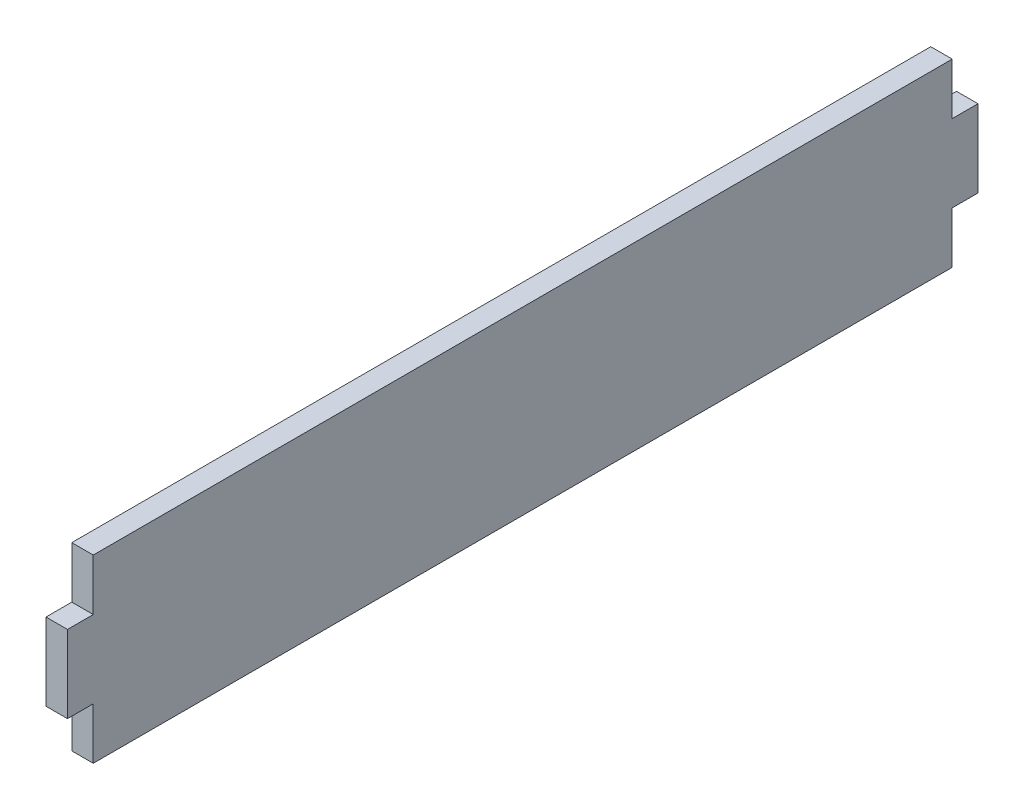
ISO-10303-21;
HEADER;
FILE_DESCRIPTION(('STEP AP214'),'2;1');
FILE_NAME('part.step','',(''),(''),'','','');
FILE_SCHEMA(('AUTOMOTIVE_DESIGN { 1 0 10303 214 1 1 1 1 }'));
ENDSEC;
DATA;
#1=APPLICATION_CONTEXT('core data for automotive mechanical design processes');
#2=APPLICATION_PROTOCOL_DEFINITION('international standard','automotive_design',2000,#1);
#3=PRODUCT_CONTEXT('',#1,'mechanical');
#4=PRODUCT('Part','Part','',(#3));
#5=PRODUCT_RELATED_PRODUCT_CATEGORY('part','',(#4));
#6=PRODUCT_DEFINITION_FORMATION('','',#4);
#7=PRODUCT_DEFINITION_CONTEXT('part definition',#1,'design');
#8=PRODUCT_DEFINITION('design','',#6,#7);
#9=PRODUCT_DEFINITION_SHAPE('','',#8);
#10=(LENGTH_UNIT() NAMED_UNIT(*) SI_UNIT(.MILLI.,.METRE.));
#11=(NAMED_UNIT(*) PLANE_ANGLE_UNIT() SI_UNIT($,.RADIAN.));
#12=(NAMED_UNIT(*) SI_UNIT($,.STERADIAN.) SOLID_ANGLE_UNIT());
#13=UNCERTAINTY_MEASURE_WITH_UNIT(LENGTH_MEASURE(1.E-05),#10,'distance_accuracy_value','');
#14=(GEOMETRIC_REPRESENTATION_CONTEXT(3) GLOBAL_UNCERTAINTY_ASSIGNED_CONTEXT((#13)) GLOBAL_UNIT_ASSIGNED_CONTEXT((#10,
#11,#12)) REPRESENTATION_CONTEXT('',''));
#15=CARTESIAN_POINT('',(0.,0.,0.));
#16=DIRECTION('',(0.,0.,1.));
#17=DIRECTION('',(1.,0.,0.));
#18=AXIS2_PLACEMENT_3D('',#15,#16,#17);
#19=CARTESIAN_POINT('',(0.,0.,100.));
#20=DIRECTION('',(0.,0.,1.));
#21=DIRECTION('',(1.,0.,0.));
#22=AXIS2_PLACEMENT_3D('',#19,#20,#21);
#23=PLANE('',#22);
#24=DIRECTION('',(0.,-1.,0.));
#25=VECTOR('',#24,1.);
#26=CARTESIAN_POINT('',(1.25,0.,100.));
#27=LINE('',#26,#25);
#28=CARTESIAN_POINT('',(1.25,-4.5,100.));
#29=VERTEX_POINT('',#28);
#30=CARTESIAN_POINT('',(1.25,-10.5,100.));
#31=VERTEX_POINT('',#30);
#32=EDGE_CURVE('E199',#29,#31,#27,.T.);
#33=ORIENTED_EDGE('',*,*,#32,.F.);
#34=DIRECTION('',(-1.,0.,0.));
#35=VECTOR('',#34,1.);
#36=CARTESIAN_POINT('',(0.,-4.5,100.));
#37=LINE('',#36,#35);
#38=CARTESIAN_POINT('',(-1.25,-4.5,100.));
#39=VERTEX_POINT('',#38);
#40=EDGE_CURVE('E158',#29,#39,#37,.T.);
#41=ORIENTED_EDGE('',*,*,#40,.T.);
#42=DIRECTION('',(0.,-1.,0.));
#43=VECTOR('',#42,1.);
#44=CARTESIAN_POINT('',(-1.25,0.,100.));
#45=LINE('',#44,#43);
#46=CARTESIAN_POINT('',(-1.25,-10.5,100.));
#47=VERTEX_POINT('',#46);
#48=EDGE_CURVE('E147',#39,#47,#45,.T.);
#49=ORIENTED_EDGE('',*,*,#48,.T.);
#50=DIRECTION('',(1.,0.,0.));
#51=VECTOR('',#50,1.);
#52=CARTESIAN_POINT('',(0.,-10.5,100.));
#53=LINE('',#52,#51);
#54=EDGE_CURVE('E196',#47,#31,#53,.T.);
#55=ORIENTED_EDGE('',*,*,#54,.T.);
#56=EDGE_LOOP('',(#33,#41,#49,#55));
#57=FACE_BOUND('',#56,.T.);
#58=ADVANCED_FACE('F42',(#57),#23,.T.);
#59=CARTESIAN_POINT('',(-1.25,10.5,100.));
#60=VERTEX_POINT('',#59);
#61=CARTESIAN_POINT('',(-1.25,4.5,100.));
#62=VERTEX_POINT('',#61);
#63=EDGE_CURVE('E193',#60,#62,#45,.T.);
#64=ORIENTED_EDGE('',*,*,#63,.T.);
#65=DIRECTION('',(1.,0.,0.));
#66=VECTOR('',#65,1.);
#67=CARTESIAN_POINT('',(0.,4.5,100.));
#68=LINE('',#67,#66);
#69=CARTESIAN_POINT('',(1.25,4.5,100.));
#70=VERTEX_POINT('',#69);
#71=EDGE_CURVE('E156',#62,#70,#68,.T.);
#72=ORIENTED_EDGE('',*,*,#71,.T.);
#73=CARTESIAN_POINT('',(1.25,10.5,100.));
#74=VERTEX_POINT('',#73);
#75=EDGE_CURVE('E200',#74,#70,#27,.T.);
#76=ORIENTED_EDGE('',*,*,#75,.F.);
#77=DIRECTION('',(1.,0.,0.));
#78=VECTOR('',#77,1.);
#79=CARTESIAN_POINT('',(0.,10.5,100.));
#80=LINE('',#79,#78);
#81=EDGE_CURVE('E203',#60,#74,#80,.T.);
#82=ORIENTED_EDGE('',*,*,#81,.F.);
#83=EDGE_LOOP('',(#64,#72,#76,#82));
#84=FACE_BOUND('',#83,.T.);
#85=ADVANCED_FACE('F254',(#84),#23,.T.);
#86=CARTESIAN_POINT('',(0.,0.,0.));
#87=DIRECTION('',(0.,0.,1.));
#88=DIRECTION('',(1.,0.,0.));
#89=AXIS2_PLACEMENT_3D('',#86,#87,#88);
#90=PLANE('',#89);
#91=DIRECTION('',(-1.,0.,0.));
#92=VECTOR('',#91,1.);
#93=CARTESIAN_POINT('',(0.,-4.5,0.));
#94=LINE('',#93,#92);
#95=CARTESIAN_POINT('',(1.25,-4.5,0.));
#96=VERTEX_POINT('',#95);
#97=CARTESIAN_POINT('',(-1.25,-4.5,0.));
#98=VERTEX_POINT('',#97);
#99=EDGE_CURVE('E65',#96,#98,#94,.T.);
#100=ORIENTED_EDGE('',*,*,#99,.F.);
#101=DIRECTION('',(0.,-1.,0.));
#102=VECTOR('',#101,1.);
#103=CARTESIAN_POINT('',(1.25,0.,0.));
#104=LINE('',#103,#102);
#105=CARTESIAN_POINT('',(1.25,-10.5,0.));
#106=VERTEX_POINT('',#105);
#107=EDGE_CURVE('E212',#96,#106,#104,.T.);
#108=ORIENTED_EDGE('',*,*,#107,.T.);
#109=DIRECTION('',(1.,0.,0.));
#110=VECTOR('',#109,1.);
#111=CARTESIAN_POINT('',(0.,-10.5,0.));
#112=LINE('',#111,#110);
#113=CARTESIAN_POINT('',(-1.25,-10.5,0.));
#114=VERTEX_POINT('',#113);
#115=EDGE_CURVE('E209',#114,#106,#112,.T.);
#116=ORIENTED_EDGE('',*,*,#115,.F.);
#117=DIRECTION('',(0.,-1.,0.));
#118=VECTOR('',#117,1.);
#119=CARTESIAN_POINT('',(-1.25,0.,0.));
#120=LINE('',#119,#118);
#121=EDGE_CURVE('E184',#98,#114,#120,.T.);
#122=ORIENTED_EDGE('',*,*,#121,.F.);
#123=EDGE_LOOP('',(#100,#108,#116,#122));
#124=FACE_BOUND('',#123,.T.);
#125=ADVANCED_FACE('F231',(#124),#90,.F.);
#126=DIRECTION('',(1.,0.,0.));
#127=VECTOR('',#126,1.);
#128=CARTESIAN_POINT('',(0.,4.5,0.));
#129=LINE('',#128,#127);
#130=CARTESIAN_POINT('',(-1.25,4.5,0.));
#131=VERTEX_POINT('',#130);
#132=CARTESIAN_POINT('',(1.25,4.5,0.));
#133=VERTEX_POINT('',#132);
#134=EDGE_CURVE('E170',#131,#133,#129,.T.);
#135=ORIENTED_EDGE('',*,*,#134,.F.);
#136=CARTESIAN_POINT('',(-1.25,10.5,0.));
#137=VERTEX_POINT('',#136);
#138=EDGE_CURVE('E207',#137,#131,#120,.T.);
#139=ORIENTED_EDGE('',*,*,#138,.F.);
#140=DIRECTION('',(1.,0.,0.));
#141=VECTOR('',#140,1.);
#142=CARTESIAN_POINT('',(0.,10.5,0.));
#143=LINE('',#142,#141);
#144=CARTESIAN_POINT('',(1.25,10.5,0.));
#145=VERTEX_POINT('',#144);
#146=EDGE_CURVE('E215',#137,#145,#143,.T.);
#147=ORIENTED_EDGE('',*,*,#146,.T.);
#148=EDGE_CURVE('E213',#145,#133,#104,.T.);
#149=ORIENTED_EDGE('',*,*,#148,.T.);
#150=EDGE_LOOP('',(#135,#139,#147,#149));
#151=FACE_BOUND('',#150,.T.);
#152=ADVANCED_FACE('F246',(#151),#90,.F.);
#153=CARTESIAN_POINT('',(-1.25,0.,100.));
#154=DIRECTION('',(1.,0.,0.));
#155=DIRECTION('',(0.,1.,0.));
#156=AXIS2_PLACEMENT_3D('',#153,#154,#155);
#157=PLANE('',#156);
#158=ORIENTED_EDGE('',*,*,#138,.T.);
#159=DIRECTION('',(0.,0.,1.));
#160=VECTOR('',#159,1.);
#161=CARTESIAN_POINT('',(-1.25,4.5,-3.));
#162=LINE('',#161,#160);
#163=CARTESIAN_POINT('',(-1.25,4.5,-3.));
#164=VERTEX_POINT('',#163);
#165=EDGE_CURVE('E185',#164,#131,#162,.T.);
#166=ORIENTED_EDGE('',*,*,#165,.F.);
#167=DIRECTION('',(0.,-1.,0.));
#168=VECTOR('',#167,1.);
#169=CARTESIAN_POINT('',(-1.25,0.,-3.));
#170=LINE('',#169,#168);
#171=CARTESIAN_POINT('',(-1.25,-4.5,-3.));
#172=VERTEX_POINT('',#171);
#173=EDGE_CURVE('E174',#164,#172,#170,.T.);
#174=ORIENTED_EDGE('',*,*,#173,.T.);
#175=DIRECTION('',(0.,0.,1.));
#176=VECTOR('',#175,1.);
#177=CARTESIAN_POINT('',(-1.25,-4.5,-3.));
#178=LINE('',#177,#176);
#179=EDGE_CURVE('E181',#172,#98,#178,.T.);
#180=ORIENTED_EDGE('',*,*,#179,.T.);
#181=ORIENTED_EDGE('',*,*,#121,.T.);
#182=DIRECTION('',(0.,0.,-1.));
#183=VECTOR('',#182,1.);
#184=CARTESIAN_POINT('',(-1.25,-10.5,100.));
#185=LINE('',#184,#183);
#186=EDGE_CURVE('E11',#47,#114,#185,.T.);
#187=ORIENTED_EDGE('',*,*,#186,.F.);
#188=ORIENTED_EDGE('',*,*,#48,.F.);
#189=DIRECTION('',(0.,0.,-1.));
#190=VECTOR('',#189,1.);
#191=CARTESIAN_POINT('',(-1.25,-4.5,103.));
#192=LINE('',#191,#190);
#193=CARTESIAN_POINT('',(-1.25,-4.5,103.));
#194=VERTEX_POINT('',#193);
#195=EDGE_CURVE('E144',#194,#39,#192,.T.);
#196=ORIENTED_EDGE('',*,*,#195,.F.);
#197=DIRECTION('',(0.,-1.,0.));
#198=VECTOR('',#197,1.);
#199=CARTESIAN_POINT('',(-1.25,0.,103.));
#200=LINE('',#199,#198);
#201=CARTESIAN_POINT('',(-1.25,4.5,103.));
#202=VERTEX_POINT('',#201);
#203=EDGE_CURVE('E133',#202,#194,#200,.T.);
#204=ORIENTED_EDGE('',*,*,#203,.F.);
#205=DIRECTION('',(0.,0.,-1.));
#206=VECTOR('',#205,1.);
#207=CARTESIAN_POINT('',(-1.25,4.5,103.));
#208=LINE('',#207,#206);
#209=EDGE_CURVE('E151',#202,#62,#208,.T.);
#210=ORIENTED_EDGE('',*,*,#209,.T.);
#211=ORIENTED_EDGE('',*,*,#63,.F.);
#212=DIRECTION('',(0.,0.,-1.));
#213=VECTOR('',#212,1.);
#214=CARTESIAN_POINT('',(-1.25,10.5,100.));
#215=LINE('',#214,#213);
#216=EDGE_CURVE('E206',#60,#137,#215,.T.);
#217=ORIENTED_EDGE('',*,*,#216,.T.);
#218=EDGE_LOOP('',(#158,#166,#174,#180,#181,#187,#188,#196,#204,#210,#211,#217));
#219=FACE_BOUND('',#218,.T.);
#220=ADVANCED_FACE('F44',(#219),#157,.F.);
#221=CARTESIAN_POINT('',(0.,-10.5,100.));
#222=DIRECTION('',(0.,1.,0.));
#223=DIRECTION('',(0.,0.,1.));
#224=AXIS2_PLACEMENT_3D('',#221,#222,#223);
#225=PLANE('',#224);
#226=ORIENTED_EDGE('',*,*,#115,.T.);
#227=DIRECTION('',(0.,0.,-1.));
#228=VECTOR('',#227,1.);
#229=CARTESIAN_POINT('',(1.25,-10.5,100.));
#230=LINE('',#229,#228);
#231=EDGE_CURVE('E50',#31,#106,#230,.T.);
#232=ORIENTED_EDGE('',*,*,#231,.F.);
#233=ORIENTED_EDGE('',*,*,#54,.F.);
#234=ORIENTED_EDGE('',*,*,#186,.T.);
#235=EDGE_LOOP('',(#226,#232,#233,#234));
#236=FACE_BOUND('',#235,.T.);
#237=ADVANCED_FACE('F230',(#236),#225,.F.);
#238=CARTESIAN_POINT('',(1.25,0.,100.));
#239=DIRECTION('',(1.,0.,0.));
#240=DIRECTION('',(0.,1.,0.));
#241=AXIS2_PLACEMENT_3D('',#238,#239,#240);
#242=PLANE('',#241);
#243=ORIENTED_EDGE('',*,*,#148,.F.);
#244=DIRECTION('',(0.,0.,-1.));
#245=VECTOR('',#244,1.);
#246=CARTESIAN_POINT('',(1.25,10.5,100.));
#247=LINE('',#246,#245);
#248=EDGE_CURVE('E219',#74,#145,#247,.T.);
#249=ORIENTED_EDGE('',*,*,#248,.F.);
#250=ORIENTED_EDGE('',*,*,#75,.T.);
#251=DIRECTION('',(0.,0.,-1.));
#252=VECTOR('',#251,1.);
#253=CARTESIAN_POINT('',(1.25,4.5,103.));
#254=LINE('',#253,#252);
#255=CARTESIAN_POINT('',(1.25,4.5,103.));
#256=VERTEX_POINT('',#255);
#257=EDGE_CURVE('E57',#256,#70,#254,.T.);
#258=ORIENTED_EDGE('',*,*,#257,.F.);
#259=DIRECTION('',(0.,-1.,0.));
#260=VECTOR('',#259,1.);
#261=CARTESIAN_POINT('',(1.25,0.,103.));
#262=LINE('',#261,#260);
#263=CARTESIAN_POINT('',(1.25,-4.5,103.));
#264=VERTEX_POINT('',#263);
#265=EDGE_CURVE('E152',#256,#264,#262,.T.);
#266=ORIENTED_EDGE('',*,*,#265,.T.);
#267=DIRECTION('',(0.,0.,-1.));
#268=VECTOR('',#267,1.);
#269=CARTESIAN_POINT('',(1.25,-4.5,103.));
#270=LINE('',#269,#268);
#271=EDGE_CURVE('E155',#264,#29,#270,.T.);
#272=ORIENTED_EDGE('',*,*,#271,.T.);
#273=ORIENTED_EDGE('',*,*,#32,.T.);
#274=ORIENTED_EDGE('',*,*,#231,.T.);
#275=ORIENTED_EDGE('',*,*,#107,.F.);
#276=DIRECTION('',(0.,0.,1.));
#277=VECTOR('',#276,1.);
#278=CARTESIAN_POINT('',(1.25,-4.5,-3.));
#279=LINE('',#278,#277);
#280=CARTESIAN_POINT('',(1.25,-4.5,-3.));
#281=VERTEX_POINT('',#280);
#282=EDGE_CURVE('E177',#281,#96,#279,.T.);
#283=ORIENTED_EDGE('',*,*,#282,.F.);
#284=DIRECTION('',(0.,-1.,0.));
#285=VECTOR('',#284,1.);
#286=CARTESIAN_POINT('',(1.25,0.,-3.));
#287=LINE('',#286,#285);
#288=CARTESIAN_POINT('',(1.25,4.5,-3.));
#289=VERTEX_POINT('',#288);
#290=EDGE_CURVE('E169',#289,#281,#287,.T.);
#291=ORIENTED_EDGE('',*,*,#290,.F.);
#292=DIRECTION('',(0.,0.,1.));
#293=VECTOR('',#292,1.);
#294=CARTESIAN_POINT('',(1.25,4.5,-3.));
#295=LINE('',#294,#293);
#296=EDGE_CURVE('E188',#289,#133,#295,.T.);
#297=ORIENTED_EDGE('',*,*,#296,.T.);
#298=EDGE_LOOP('',(#243,#249,#250,#258,#266,#272,#273,#274,#275,#283,#291,#297));
#299=FACE_BOUND('',#298,.T.);
#300=ADVANCED_FACE('F224',(#299),#242,.T.);
#301=CARTESIAN_POINT('',(0.,10.5,100.));
#302=DIRECTION('',(0.,1.,0.));
#303=DIRECTION('',(0.,0.,1.));
#304=AXIS2_PLACEMENT_3D('',#301,#302,#303);
#305=PLANE('',#304);
#306=ORIENTED_EDGE('',*,*,#146,.F.);
#307=ORIENTED_EDGE('',*,*,#216,.F.);
#308=ORIENTED_EDGE('',*,*,#81,.T.);
#309=ORIENTED_EDGE('',*,*,#248,.T.);
#310=EDGE_LOOP('',(#306,#307,#308,#309));
#311=FACE_BOUND('',#310,.T.);
#312=ADVANCED_FACE('F251',(#311),#305,.T.);
#313=CARTESIAN_POINT('',(0.,-4.5,-3.));
#314=DIRECTION('',(0.,1.,0.));
#315=DIRECTION('',(0.,0.,1.));
#316=AXIS2_PLACEMENT_3D('',#313,#314,#315);
#317=PLANE('',#316);
#318=ORIENTED_EDGE('',*,*,#99,.T.);
#319=ORIENTED_EDGE('',*,*,#179,.F.);
#320=DIRECTION('',(-1.,0.,0.));
#321=VECTOR('',#320,1.);
#322=CARTESIAN_POINT('',(0.,-4.5,-3.));
#323=LINE('',#322,#321);
#324=EDGE_CURVE('E167',#281,#172,#323,.T.);
#325=ORIENTED_EDGE('',*,*,#324,.F.);
#326=ORIENTED_EDGE('',*,*,#282,.T.);
#327=EDGE_LOOP('',(#318,#319,#325,#326));
#328=FACE_BOUND('',#327,.T.);
#329=ADVANCED_FACE('F236',(#328),#317,.F.);
#330=CARTESIAN_POINT('',(0.,4.5,-3.));
#331=DIRECTION('',(0.,-1.,0.));
#332=DIRECTION('',(0.,0.,-1.));
#333=AXIS2_PLACEMENT_3D('',#330,#331,#332);
#334=PLANE('',#333);
#335=ORIENTED_EDGE('',*,*,#134,.T.);
#336=ORIENTED_EDGE('',*,*,#296,.F.);
#337=DIRECTION('',(1.,0.,0.));
#338=VECTOR('',#337,1.);
#339=CARTESIAN_POINT('',(0.,4.5,-3.));
#340=LINE('',#339,#338);
#341=EDGE_CURVE('E172',#164,#289,#340,.T.);
#342=ORIENTED_EDGE('',*,*,#341,.F.);
#343=ORIENTED_EDGE('',*,*,#165,.T.);
#344=EDGE_LOOP('',(#335,#336,#342,#343));
#345=FACE_BOUND('',#344,.T.);
#346=ADVANCED_FACE('F243',(#345),#334,.F.);
#347=CARTESIAN_POINT('',(0.,0.,-3.));
#348=DIRECTION('',(0.,0.,1.));
#349=DIRECTION('',(1.,0.,0.));
#350=AXIS2_PLACEMENT_3D('',#347,#348,#349);
#351=PLANE('',#350);
#352=ORIENTED_EDGE('',*,*,#324,.T.);
#353=ORIENTED_EDGE('',*,*,#173,.F.);
#354=ORIENTED_EDGE('',*,*,#341,.T.);
#355=ORIENTED_EDGE('',*,*,#290,.T.);
#356=EDGE_LOOP('',(#352,#353,#354,#355));
#357=FACE_BOUND('',#356,.T.);
#358=ADVANCED_FACE('F240',(#357),#351,.F.);
#359=CARTESIAN_POINT('',(0.,-4.5,103.));
#360=DIRECTION('',(0.,-1.,0.));
#361=DIRECTION('',(0.,0.,-1.));
#362=AXIS2_PLACEMENT_3D('',#359,#360,#361);
#363=PLANE('',#362);
#364=ORIENTED_EDGE('',*,*,#40,.F.);
#365=ORIENTED_EDGE('',*,*,#271,.F.);
#366=DIRECTION('',(-1.,0.,0.));
#367=VECTOR('',#366,1.);
#368=CARTESIAN_POINT('',(0.,-4.5,103.));
#369=LINE('',#368,#367);
#370=EDGE_CURVE('E138',#264,#194,#369,.T.);
#371=ORIENTED_EDGE('',*,*,#370,.T.);
#372=ORIENTED_EDGE('',*,*,#195,.T.);
#373=EDGE_LOOP('',(#364,#365,#371,#372));
#374=FACE_BOUND('',#373,.T.);
#375=ADVANCED_FACE('F154',(#374),#363,.T.);
#376=CARTESIAN_POINT('',(0.,4.5,103.));
#377=DIRECTION('',(0.,1.,0.));
#378=DIRECTION('',(0.,0.,1.));
#379=AXIS2_PLACEMENT_3D('',#376,#377,#378);
#380=PLANE('',#379);
#381=ORIENTED_EDGE('',*,*,#71,.F.);
#382=ORIENTED_EDGE('',*,*,#209,.F.);
#383=DIRECTION('',(1.,0.,0.));
#384=VECTOR('',#383,1.);
#385=CARTESIAN_POINT('',(0.,4.5,103.));
#386=LINE('',#385,#384);
#387=EDGE_CURVE('E140',#202,#256,#386,.T.);
#388=ORIENTED_EDGE('',*,*,#387,.T.);
#389=ORIENTED_EDGE('',*,*,#257,.T.);
#390=EDGE_LOOP('',(#381,#382,#388,#389));
#391=FACE_BOUND('',#390,.T.);
#392=ADVANCED_FACE('F255',(#391),#380,.T.);
#393=CARTESIAN_POINT('',(0.,0.,103.));
#394=DIRECTION('',(0.,0.,-1.));
#395=DIRECTION('',(1.,0.,0.));
#396=AXIS2_PLACEMENT_3D('',#393,#394,#395);
#397=PLANE('',#396);
#398=ORIENTED_EDGE('',*,*,#370,.F.);
#399=ORIENTED_EDGE('',*,*,#265,.F.);
#400=ORIENTED_EDGE('',*,*,#387,.F.);
#401=ORIENTED_EDGE('',*,*,#203,.T.);
#402=EDGE_LOOP('',(#398,#399,#400,#401));
#403=FACE_BOUND('',#402,.T.);
#404=ADVANCED_FACE('F135',(#403),#397,.F.);
#405=CLOSED_SHELL('',(#58,#85,#125,#152,#220,#237,#300,#312,#329,#346,#358,#375,#392,#404));
#406=MANIFOLD_SOLID_BREP('B2',#405);
#407=ADVANCED_BREP_SHAPE_REPRESENTATION('',(#18,#406),#14);
#408=SHAPE_DEFINITION_REPRESENTATION(#9,#407);
ENDSEC;
END-ISO-10303-21;
